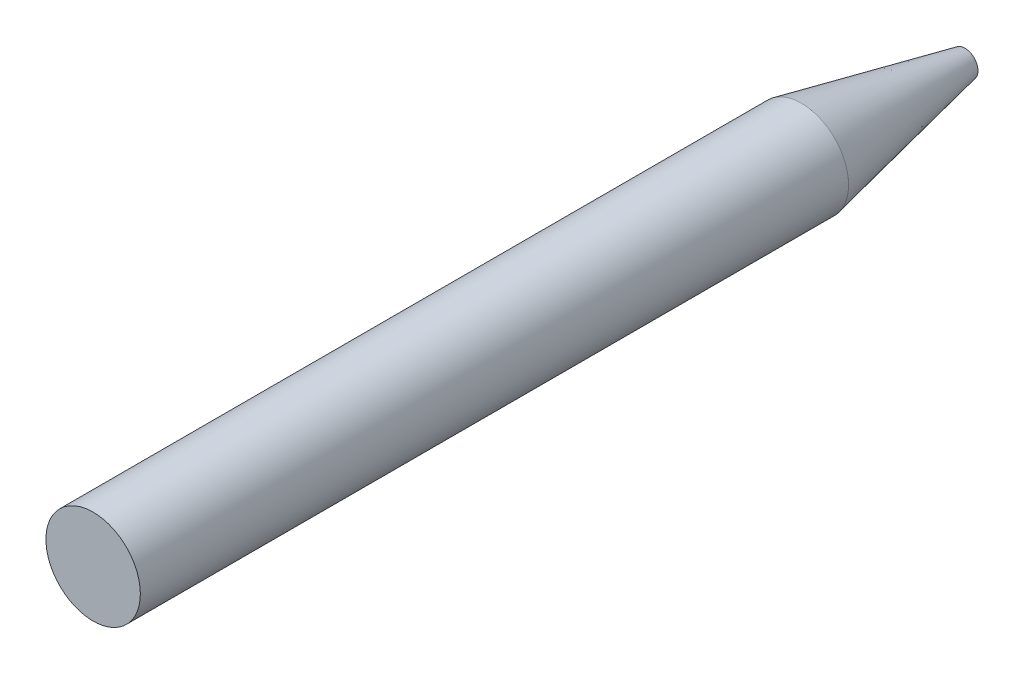
ISO-10303-21;
HEADER;
FILE_DESCRIPTION(('STEP AP214'),'2;1');
FILE_NAME('part.step','',(''),(''),'','','');
FILE_SCHEMA(('AUTOMOTIVE_DESIGN { 1 0 10303 214 1 1 1 1 }'));
ENDSEC;
DATA;
#1=APPLICATION_CONTEXT('core data for automotive mechanical design processes');
#2=APPLICATION_PROTOCOL_DEFINITION('international standard','automotive_design',2000,#1);
#3=PRODUCT_CONTEXT('',#1,'mechanical');
#4=PRODUCT('Part','Part','',(#3));
#5=PRODUCT_RELATED_PRODUCT_CATEGORY('part','',(#4));
#6=PRODUCT_DEFINITION_FORMATION('','',#4);
#7=PRODUCT_DEFINITION_CONTEXT('part definition',#1,'design');
#8=PRODUCT_DEFINITION('design','',#6,#7);
#9=PRODUCT_DEFINITION_SHAPE('','',#8);
#10=(LENGTH_UNIT() NAMED_UNIT(*) SI_UNIT(.MILLI.,.METRE.));
#11=(NAMED_UNIT(*) PLANE_ANGLE_UNIT() SI_UNIT($,.RADIAN.));
#12=(NAMED_UNIT(*) SI_UNIT($,.STERADIAN.) SOLID_ANGLE_UNIT());
#13=UNCERTAINTY_MEASURE_WITH_UNIT(LENGTH_MEASURE(1.E-05),#10,'distance_accuracy_value','');
#14=(GEOMETRIC_REPRESENTATION_CONTEXT(3) GLOBAL_UNCERTAINTY_ASSIGNED_CONTEXT((#13)) GLOBAL_UNIT_ASSIGNED_CONTEXT((#10,
#11,#12)) REPRESENTATION_CONTEXT('',''));
#15=CARTESIAN_POINT('',(0.,0.,0.));
#16=DIRECTION('',(0.,0.,1.));
#17=DIRECTION('',(1.,0.,0.));
#18=AXIS2_PLACEMENT_3D('',#15,#16,#17);
#19=CARTESIAN_POINT('',(0.,0.,381.));
#20=DIRECTION('',(0.,0.,-1.));
#21=DIRECTION('',(-1.,0.,0.));
#22=AXIS2_PLACEMENT_3D('',#19,#20,#21);
#23=CYLINDRICAL_SURFACE('',#22,25.4);
#24=CARTESIAN_POINT('',(0.,0.,381.));
#25=DIRECTION('',(0.,0.,1.));
#26=DIRECTION('',(1.,0.,0.));
#27=AXIS2_PLACEMENT_3D('',#24,#25,#26);
#28=CIRCLE('',#27,25.4);
#29=CARTESIAN_POINT('',(25.4,0.,381.));
#30=VERTEX_POINT('',#29);
#31=EDGE_CURVE('E10',#30,#30,#28,.T.);
#32=ORIENTED_EDGE('',*,*,#31,.F.);
#33=EDGE_LOOP('',(#32));
#34=FACE_BOUND('',#33,.T.);
#35=CARTESIAN_POINT('',(0.,0.,0.));
#36=DIRECTION('',(0.,0.,1.));
#37=DIRECTION('',(1.,0.,0.));
#38=AXIS2_PLACEMENT_3D('',#35,#36,#37);
#39=CIRCLE('',#38,25.4);
#40=CARTESIAN_POINT('',(25.4,0.,0.));
#41=VERTEX_POINT('',#40);
#42=EDGE_CURVE('E40',#41,#41,#39,.T.);
#43=ORIENTED_EDGE('',*,*,#42,.T.);
#44=EDGE_LOOP('',(#43));
#45=FACE_BOUND('',#44,.T.);
#46=ADVANCED_FACE('F34',(#34,#45),#23,.T.);
#47=CARTESIAN_POINT('',(0.,0.,381.));
#48=DIRECTION('',(0.,0.,1.));
#49=DIRECTION('',(1.,0.,0.));
#50=AXIS2_PLACEMENT_3D('',#47,#48,#49);
#51=PLANE('',#50);
#52=ORIENTED_EDGE('',*,*,#31,.T.);
#53=EDGE_LOOP('',(#52));
#54=FACE_BOUND('',#53,.T.);
#55=ADVANCED_FACE('F59',(#54),#51,.T.);
#56=CARTESIAN_POINT('',(0.,0.,-88.0111748769165));
#57=DIRECTION('',(0.,0.,1.));
#58=DIRECTION('',(1.,0.,0.));
#59=AXIS2_PLACEMENT_3D('',#56,#57,#58);
#60=CONICAL_SURFACE('',#59,7.01096367554255,0.205976547652272);
#61=CARTESIAN_POINT('',(0.,0.,-88.0111748769165));
#62=DIRECTION('',(0.,0.,1.));
#63=DIRECTION('',(1.,0.,0.));
#64=AXIS2_PLACEMENT_3D('',#61,#62,#63);
#65=CIRCLE('',#64,7.01096367554255);
#66=CARTESIAN_POINT('',(7.01096367554255,0.,-88.0111748769165));
#67=VERTEX_POINT('',#66);
#68=EDGE_CURVE('E44',#67,#67,#65,.T.);
#69=CARTESIAN_POINT('',(25.4,0.,0.));
#70=CARTESIAN_POINT('',(25.2084475382869,0.,-0.916783071634545));
#71=CARTESIAN_POINT('',(25.0168950765738,0.,-1.83356614326909));
#72=CARTESIAN_POINT('',(24.6337901531476,0.,-3.66713228653819));
#73=CARTESIAN_POINT('',(24.4422376914345,0.,-4.58391535817274));
#74=CARTESIAN_POINT('',(24.0591327680083,0.,-6.41748150144183));
#75=CARTESIAN_POINT('',(23.8675803062952,0.,-7.33426457307638));
#76=CARTESIAN_POINT('',(23.484475382869,0.,-9.16783071634547));
#77=CARTESIAN_POINT('',(23.2929229211559,0.,-10.08461378798));
#78=CARTESIAN_POINT('',(22.9098179977297,0.,-11.9181799312491));
#79=CARTESIAN_POINT('',(22.7182655360166,0.,-12.8349630028837));
#80=CARTESIAN_POINT('',(22.3351606125904,0.,-14.6685291461528));
#81=CARTESIAN_POINT('',(22.1436081508773,0.,-15.5853122177873));
#82=CARTESIAN_POINT('',(21.7605032274511,0.,-17.4188783610564));
#83=CARTESIAN_POINT('',(21.568950765738,0.,-18.3356614326909));
#84=CARTESIAN_POINT('',(21.1858458423118,0.,-20.16922757596));
#85=CARTESIAN_POINT('',(20.9942933805987,0.,-21.0860106475946));
#86=CARTESIAN_POINT('',(20.6111884571725,0.,-22.9195767908637));
#87=CARTESIAN_POINT('',(20.4196359954594,0.,-23.8363598624982));
#88=CARTESIAN_POINT('',(20.0365310720332,0.,-25.6699260057673));
#89=CARTESIAN_POINT('',(19.8449786103201,0.,-26.5867090774019));
#90=CARTESIAN_POINT('',(19.4618736868939,0.,-28.420275220671));
#91=CARTESIAN_POINT('',(19.2703212251809,0.,-29.3370582923055));
#92=CARTESIAN_POINT('',(18.8872163017547,0.,-31.1706244355746));
#93=CARTESIAN_POINT('',(18.6956638400416,0.,-32.0874075072091));
#94=CARTESIAN_POINT('',(18.3125589166154,0.,-33.9209736504782));
#95=CARTESIAN_POINT('',(18.1210064549023,0.,-34.8377567221128));
#96=CARTESIAN_POINT('',(17.7379015314761,0.,-36.6713228653819));
#97=CARTESIAN_POINT('',(17.546349069763,0.,-37.5881059370164));
#98=CARTESIAN_POINT('',(17.1632441463368,0.,-39.4216720802855));
#99=CARTESIAN_POINT('',(16.9716916846237,0.,-40.3384551519201));
#100=CARTESIAN_POINT('',(16.5885867611975,0.,-42.1720212951892));
#101=CARTESIAN_POINT('',(16.3970342994844,0.,-43.0888043668237));
#102=CARTESIAN_POINT('',(16.0139293760582,0.,-44.9223705100928));
#103=CARTESIAN_POINT('',(15.8223769143451,0.,-45.8391535817273));
#104=CARTESIAN_POINT('',(15.4392719909189,0.,-47.6727197249964));
#105=CARTESIAN_POINT('',(15.2477195292058,0.,-48.589502796631));
#106=CARTESIAN_POINT('',(14.8646146057796,0.,-50.4230689399001));
#107=CARTESIAN_POINT('',(14.6730621440665,0.,-51.3398520115346));
#108=CARTESIAN_POINT('',(14.2899572206403,0.,-53.1734181548037));
#109=CARTESIAN_POINT('',(14.0984047589272,0.,-54.0902012264383));
#110=CARTESIAN_POINT('',(13.715299835501,0.,-55.9237673697074));
#111=CARTESIAN_POINT('',(13.5237473737879,0.,-56.8405504413419));
#112=CARTESIAN_POINT('',(13.1406424503617,0.,-58.674116584611));
#113=CARTESIAN_POINT('',(12.9490899886486,0.,-59.5908996562455));
#114=CARTESIAN_POINT('',(12.5659850652224,0.,-61.4244657995146));
#115=CARTESIAN_POINT('',(12.3744326035093,0.,-62.3412488711492));
#116=CARTESIAN_POINT('',(11.9913276800831,0.,-64.1748150144183));
#117=CARTESIAN_POINT('',(11.79977521837,0.,-65.0915980860528));
#118=CARTESIAN_POINT('',(11.4166702949438,0.,-66.9251642293219));
#119=CARTESIAN_POINT('',(11.2251178332307,0.,-67.8419473009565));
#120=CARTESIAN_POINT('',(10.8420129098045,0.,-69.6755134442256));
#121=CARTESIAN_POINT('',(10.6504604480914,0.,-70.5922965158601));
#122=CARTESIAN_POINT('',(10.2673555246652,0.,-72.4258626591292));
#123=CARTESIAN_POINT('',(10.0758030629521,0.,-73.3426457307637));
#124=CARTESIAN_POINT('',(9.69269813952592,0.,-75.1762118740328));
#125=CARTESIAN_POINT('',(9.50114567781283,0.,-76.0929949456674));
#126=CARTESIAN_POINT('',(9.11804075438663,0.,-77.9265610889365));
#127=CARTESIAN_POINT('',(8.92648829267353,0.,-78.843344160571));
#128=CARTESIAN_POINT('',(8.54338336924733,0.,-80.6769103038401));
#129=CARTESIAN_POINT('',(8.35183090753423,0.,-81.5936933754747));
#130=CARTESIAN_POINT('',(7.96872598410804,0.,-83.4272595187438));
#131=CARTESIAN_POINT('',(7.77717352239494,0.,-84.3440425903783));
#132=CARTESIAN_POINT('',(7.39406859896874,0.,-86.1776087336474));
#133=CARTESIAN_POINT('',(7.20251613725564,0.,-87.0943918052819));
#134=CARTESIAN_POINT('',(7.01096367554254,0.,-88.0111748769165));
#135=B_SPLINE_CURVE_WITH_KNOTS('',3,(#69,#70,#71,#72,#73,#74,#75,#76,#77,#78,#79,#80,#81,#82,
#83,#84,#85,#86,#87,#88,#89,#90,#91,#92,#93,#94,#95,#96,#97,#98,#99,#100,#101,#102,#103,#104,
#105,#106,#107,#108,#109,#110,#111,#112,#113,#114,#115,#116,#117,#118,#119,#120,#121,#122,#123,
#124,#125,#126,#127,#128,#129,#130,#131,#132,#133,#134),.UNSPECIFIED.,.F.,.F.,(4,2,2,2,2,2,2,2,
2,2,2,2,2,2,2,2,2,2,2,2,2,2,2,2,2,2,2,2,2,2,2,2,4),(0.,2.80974232167581,5.61948464335164,
8.42922696502745,11.2389692867033,14.0487116083791,16.8584539300549,19.6681962517307,
22.4779385734065,25.2876808950823,28.0974232167582,30.907165538434,33.7169078601098,
36.5266501817856,39.3363925034614,42.1461348251372,44.9558771468131,47.7656194684889,
50.5753617901647,53.3851041118405,56.1948464335163,59.0045887551921,61.8143310768679,
64.6240733985438,67.4338157202196,70.2435580418954,73.0533003635712,75.863042685247,
78.6727850069229,81.4825273285987,84.2922696502745,87.1020119719503,89.9117542936261),.UNSPECIFIED.);
#136=EDGE_CURVE('BSEAM51',#41,#67,#135,.T.);
#137=ORIENTED_EDGE('',*,*,#42,.F.);
#138=ORIENTED_EDGE('',*,*,#68,.T.);
#139=ORIENTED_EDGE('',*,*,#136,.T.);
#140=ORIENTED_EDGE('',*,*,#136,.F.);
#141=EDGE_LOOP('',(#137,#139,#138,#140));
#142=FACE_BOUND('',#141,.T.);
#143=ADVANCED_FACE('F51',(#142),#60,.T.);
#144=CARTESIAN_POINT('',(0.,0.,-88.0111748769165));
#145=DIRECTION('',(0.,0.,1.));
#146=DIRECTION('',(1.,0.,0.));
#147=AXIS2_PLACEMENT_3D('',#144,#145,#146);
#148=PLANE('',#147);
#149=ORIENTED_EDGE('',*,*,#68,.F.);
#150=EDGE_LOOP('',(#149));
#151=FACE_BOUND('',#150,.T.);
#152=ADVANCED_FACE('F53',(#151),#148,.F.);
#153=CLOSED_SHELL('',(#46,#55,#143,#152));
#154=MANIFOLD_SOLID_BREP('B2',#153);
#155=ADVANCED_BREP_SHAPE_REPRESENTATION('',(#18,#154),#14);
#156=SHAPE_DEFINITION_REPRESENTATION(#9,#155);
ENDSEC;
END-ISO-10303-21;
